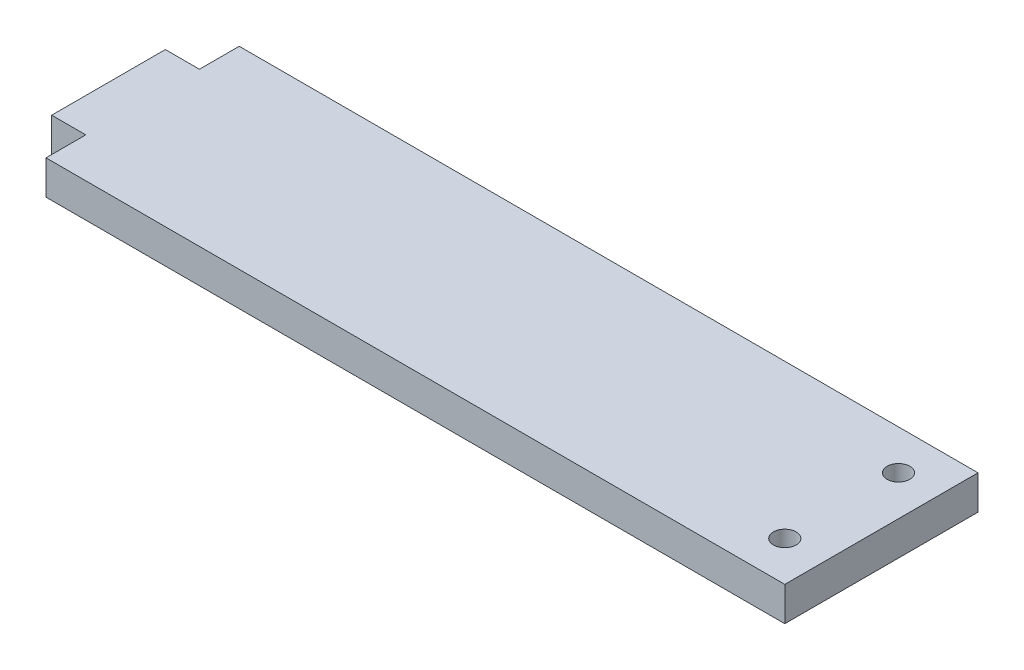
ISO-10303-21;
HEADER;
FILE_DESCRIPTION(('STEP AP214'),'2;1');
FILE_NAME('part.step','',(''),(''),'','','');
FILE_SCHEMA(('AUTOMOTIVE_DESIGN { 1 0 10303 214 1 1 1 1 }'));
ENDSEC;
DATA;
#1=APPLICATION_CONTEXT('core data for automotive mechanical design processes');
#2=APPLICATION_PROTOCOL_DEFINITION('international standard','automotive_design',2000,#1);
#3=PRODUCT_CONTEXT('',#1,'mechanical');
#4=PRODUCT('Part','Part','',(#3));
#5=PRODUCT_RELATED_PRODUCT_CATEGORY('part','',(#4));
#6=PRODUCT_DEFINITION_FORMATION('','',#4);
#7=PRODUCT_DEFINITION_CONTEXT('part definition',#1,'design');
#8=PRODUCT_DEFINITION('design','',#6,#7);
#9=PRODUCT_DEFINITION_SHAPE('','',#8);
#10=(LENGTH_UNIT() NAMED_UNIT(*) SI_UNIT(.MILLI.,.METRE.));
#11=(NAMED_UNIT(*) PLANE_ANGLE_UNIT() SI_UNIT($,.RADIAN.));
#12=(NAMED_UNIT(*) SI_UNIT($,.STERADIAN.) SOLID_ANGLE_UNIT());
#13=UNCERTAINTY_MEASURE_WITH_UNIT(LENGTH_MEASURE(1.E-05),#10,'distance_accuracy_value','');
#14=(GEOMETRIC_REPRESENTATION_CONTEXT(3) GLOBAL_UNCERTAINTY_ASSIGNED_CONTEXT((#13)) GLOBAL_UNIT_ASSIGNED_CONTEXT((#10,
#11,#12)) REPRESENTATION_CONTEXT('',''));
#15=CARTESIAN_POINT('',(0.,0.,0.));
#16=DIRECTION('',(0.,0.,1.));
#17=DIRECTION('',(1.,0.,0.));
#18=AXIS2_PLACEMENT_3D('',#15,#16,#17);
#19=CARTESIAN_POINT('',(-353.88953364633,6.,-10.));
#20=DIRECTION('',(0.,0.,1.));
#21=DIRECTION('',(1.,0.,0.));
#22=AXIS2_PLACEMENT_3D('',#19,#20,#21);
#23=PLANE('',#22);
#24=DIRECTION('',(-1.,0.,0.));
#25=VECTOR('',#24,1.);
#26=CARTESIAN_POINT('',(-353.88953364633,0.,-10.));
#27=LINE('',#26,#25);
#28=CARTESIAN_POINT('',(-347.88953364633,0.,-10.));
#29=VERTEX_POINT('',#28);
#30=CARTESIAN_POINT('',(-353.88953364633,0.,-10.));
#31=VERTEX_POINT('',#30);
#32=EDGE_CURVE('E130',#29,#31,#27,.T.);
#33=ORIENTED_EDGE('',*,*,#32,.T.);
#34=DIRECTION('',(0.,-1.,0.));
#35=VECTOR('',#34,1.);
#36=CARTESIAN_POINT('',(-353.88953364633,6.,-10.));
#37=LINE('',#36,#35);
#38=CARTESIAN_POINT('',(-353.88953364633,6.,-10.));
#39=VERTEX_POINT('',#38);
#40=EDGE_CURVE('E11',#39,#31,#37,.T.);
#41=ORIENTED_EDGE('',*,*,#40,.F.);
#42=DIRECTION('',(-1.,0.,0.));
#43=VECTOR('',#42,1.);
#44=CARTESIAN_POINT('',(-353.88953364633,6.,-10.));
#45=LINE('',#44,#43);
#46=CARTESIAN_POINT('',(-347.88953364633,6.,-10.));
#47=VERTEX_POINT('',#46);
#48=EDGE_CURVE('E145',#47,#39,#45,.T.);
#49=ORIENTED_EDGE('',*,*,#48,.F.);
#50=DIRECTION('',(0.,-1.,0.));
#51=VECTOR('',#50,1.);
#52=CARTESIAN_POINT('',(-347.88953364633,6.,-10.));
#53=LINE('',#52,#51);
#54=EDGE_CURVE('E126',#47,#29,#53,.T.);
#55=ORIENTED_EDGE('',*,*,#54,.T.);
#56=EDGE_LOOP('',(#33,#41,#49,#55));
#57=FACE_BOUND('',#56,.T.);
#58=ADVANCED_FACE('F34',(#57),#23,.F.);
#59=CARTESIAN_POINT('',(-353.88953364633,6.,-10.));
#60=DIRECTION('',(1.,0.,0.));
#61=DIRECTION('',(0.,0.,-1.));
#62=AXIS2_PLACEMENT_3D('',#59,#60,#61);
#63=PLANE('',#62);
#64=DIRECTION('',(0.,0.,1.));
#65=VECTOR('',#64,1.);
#66=CARTESIAN_POINT('',(-353.88953364633,0.,-10.));
#67=LINE('',#66,#65);
#68=CARTESIAN_POINT('',(-353.88953364633,0.,10.));
#69=VERTEX_POINT('',#68);
#70=EDGE_CURVE('E133',#31,#69,#67,.T.);
#71=ORIENTED_EDGE('',*,*,#70,.T.);
#72=DIRECTION('',(0.,-1.,0.));
#73=VECTOR('',#72,1.);
#74=CARTESIAN_POINT('',(-353.88953364633,6.,10.));
#75=LINE('',#74,#73);
#76=CARTESIAN_POINT('',(-353.88953364633,6.,10.));
#77=VERTEX_POINT('',#76);
#78=EDGE_CURVE('E42',#77,#69,#75,.T.);
#79=ORIENTED_EDGE('',*,*,#78,.F.);
#80=DIRECTION('',(0.,0.,1.));
#81=VECTOR('',#80,1.);
#82=CARTESIAN_POINT('',(-353.88953364633,6.,-10.));
#83=LINE('',#82,#81);
#84=EDGE_CURVE('E93',#39,#77,#83,.T.);
#85=ORIENTED_EDGE('',*,*,#84,.F.);
#86=ORIENTED_EDGE('',*,*,#40,.T.);
#87=EDGE_LOOP('',(#71,#79,#85,#86));
#88=FACE_BOUND('',#87,.T.);
#89=ADVANCED_FACE('F229',(#88),#63,.F.);
#90=CARTESIAN_POINT('',(-353.88953364633,6.,10.));
#91=DIRECTION('',(0.,0.,-1.));
#92=DIRECTION('',(-1.,0.,0.));
#93=AXIS2_PLACEMENT_3D('',#90,#91,#92);
#94=PLANE('',#93);
#95=DIRECTION('',(1.,0.,0.));
#96=VECTOR('',#95,1.);
#97=CARTESIAN_POINT('',(-353.88953364633,0.,10.));
#98=LINE('',#97,#96);
#99=CARTESIAN_POINT('',(-347.88953364633,0.,10.));
#100=VERTEX_POINT('',#99);
#101=EDGE_CURVE('E136',#69,#100,#98,.T.);
#102=ORIENTED_EDGE('',*,*,#101,.T.);
#103=DIRECTION('',(0.,-1.,0.));
#104=VECTOR('',#103,1.);
#105=CARTESIAN_POINT('',(-347.88953364633,6.,10.));
#106=LINE('',#105,#104);
#107=CARTESIAN_POINT('',(-347.88953364633,6.,10.));
#108=VERTEX_POINT('',#107);
#109=EDGE_CURVE('E152',#108,#100,#106,.T.);
#110=ORIENTED_EDGE('',*,*,#109,.F.);
#111=DIRECTION('',(1.,0.,0.));
#112=VECTOR('',#111,1.);
#113=CARTESIAN_POINT('',(-353.88953364633,6.,10.));
#114=LINE('',#113,#112);
#115=EDGE_CURVE('E160',#77,#108,#114,.T.);
#116=ORIENTED_EDGE('',*,*,#115,.F.);
#117=ORIENTED_EDGE('',*,*,#78,.T.);
#118=EDGE_LOOP('',(#102,#110,#116,#117));
#119=FACE_BOUND('',#118,.T.);
#120=ADVANCED_FACE('F158',(#119),#94,.F.);
#121=CARTESIAN_POINT('',(-347.88953364633,6.,10.));
#122=DIRECTION('',(1.,0.,0.));
#123=DIRECTION('',(0.,0.,-1.));
#124=AXIS2_PLACEMENT_3D('',#121,#122,#123);
#125=PLANE('',#124);
#126=CARTESIAN_POINT('',(-347.88953364633,3.,13.5));
#127=DIRECTION('',(-1.,0.,0.));
#128=DIRECTION('',(0.,0.,1.));
#129=AXIS2_PLACEMENT_3D('',#126,#127,#128);
#130=CIRCLE('',#129,2.);
#131=CARTESIAN_POINT('',(-347.88953364633,3.,15.5));
#132=VERTEX_POINT('',#131);
#133=EDGE_CURVE('E184',#132,#132,#130,.T.);
#134=ORIENTED_EDGE('',*,*,#133,.F.);
#135=EDGE_LOOP('',(#134));
#136=FACE_BOUND('',#135,.T.);
#137=DIRECTION('',(0.,0.,1.));
#138=VECTOR('',#137,1.);
#139=CARTESIAN_POINT('',(-347.88953364633,0.,10.));
#140=LINE('',#139,#138);
#141=CARTESIAN_POINT('',(-347.88953364633,0.,17.));
#142=VERTEX_POINT('',#141);
#143=EDGE_CURVE('E138',#100,#142,#140,.T.);
#144=ORIENTED_EDGE('',*,*,#143,.T.);
#145=DIRECTION('',(0.,-1.,0.));
#146=VECTOR('',#145,1.);
#147=CARTESIAN_POINT('',(-347.88953364633,6.,17.));
#148=LINE('',#147,#146);
#149=CARTESIAN_POINT('',(-347.88953364633,6.,17.));
#150=VERTEX_POINT('',#149);
#151=EDGE_CURVE('E149',#150,#142,#148,.T.);
#152=ORIENTED_EDGE('',*,*,#151,.F.);
#153=DIRECTION('',(0.,0.,1.));
#154=VECTOR('',#153,1.);
#155=CARTESIAN_POINT('',(-347.88953364633,6.,10.));
#156=LINE('',#155,#154);
#157=EDGE_CURVE('E172',#108,#150,#156,.T.);
#158=ORIENTED_EDGE('',*,*,#157,.F.);
#159=ORIENTED_EDGE('',*,*,#109,.T.);
#160=EDGE_LOOP('',(#144,#152,#158,#159));
#161=FACE_BOUND('',#160,.T.);
#162=ADVANCED_FACE('F168',(#136,#161),#125,.F.);
#163=CARTESIAN_POINT('',(-347.88953364633,6.,17.));
#164=DIRECTION('',(0.,0.,-1.));
#165=DIRECTION('',(-1.,0.,0.));
#166=AXIS2_PLACEMENT_3D('',#163,#164,#165);
#167=PLANE('',#166);
#168=DIRECTION('',(1.,0.,0.));
#169=VECTOR('',#168,1.);
#170=CARTESIAN_POINT('',(-347.88953364633,0.,17.));
#171=LINE('',#170,#169);
#172=CARTESIAN_POINT('',(-217.88953364633,0.,17.));
#173=VERTEX_POINT('',#172);
#174=EDGE_CURVE('E140',#142,#173,#171,.T.);
#175=ORIENTED_EDGE('',*,*,#174,.T.);
#176=DIRECTION('',(0.,-1.,0.));
#177=VECTOR('',#176,1.);
#178=CARTESIAN_POINT('',(-217.88953364633,6.,17.));
#179=LINE('',#178,#177);
#180=CARTESIAN_POINT('',(-217.88953364633,6.,17.));
#181=VERTEX_POINT('',#180);
#182=EDGE_CURVE('E121',#181,#173,#179,.T.);
#183=ORIENTED_EDGE('',*,*,#182,.F.);
#184=DIRECTION('',(1.,0.,0.));
#185=VECTOR('',#184,1.);
#186=CARTESIAN_POINT('',(-347.88953364633,6.,17.));
#187=LINE('',#186,#185);
#188=EDGE_CURVE('E112',#150,#181,#187,.T.);
#189=ORIENTED_EDGE('',*,*,#188,.F.);
#190=ORIENTED_EDGE('',*,*,#151,.T.);
#191=EDGE_LOOP('',(#175,#183,#189,#190));
#192=FACE_BOUND('',#191,.T.);
#193=ADVANCED_FACE('F171',(#192),#167,.F.);
#194=CARTESIAN_POINT('',(-217.88953364633,6.,-17.));
#195=DIRECTION('',(-1.,0.,0.));
#196=DIRECTION('',(0.,0.,1.));
#197=AXIS2_PLACEMENT_3D('',#194,#195,#196);
#198=PLANE('',#197);
#199=DIRECTION('',(0.,0.,-1.));
#200=VECTOR('',#199,1.);
#201=CARTESIAN_POINT('',(-217.88953364633,0.,-17.));
#202=LINE('',#201,#200);
#203=CARTESIAN_POINT('',(-217.88953364633,0.,-17.));
#204=VERTEX_POINT('',#203);
#205=EDGE_CURVE('E120',#173,#204,#202,.T.);
#206=ORIENTED_EDGE('',*,*,#205,.T.);
#207=DIRECTION('',(0.,-1.,0.));
#208=VECTOR('',#207,1.);
#209=CARTESIAN_POINT('',(-217.88953364633,6.,-17.));
#210=LINE('',#209,#208);
#211=CARTESIAN_POINT('',(-217.88953364633,6.,-17.));
#212=VERTEX_POINT('',#211);
#213=EDGE_CURVE('E117',#212,#204,#210,.T.);
#214=ORIENTED_EDGE('',*,*,#213,.F.);
#215=DIRECTION('',(0.,0.,-1.));
#216=VECTOR('',#215,1.);
#217=CARTESIAN_POINT('',(-217.88953364633,6.,-17.));
#218=LINE('',#217,#216);
#219=EDGE_CURVE('E106',#181,#212,#218,.T.);
#220=ORIENTED_EDGE('',*,*,#219,.F.);
#221=ORIENTED_EDGE('',*,*,#182,.T.);
#222=EDGE_LOOP('',(#206,#214,#220,#221));
#223=FACE_BOUND('',#222,.T.);
#224=ADVANCED_FACE('F118',(#223),#198,.F.);
#225=CARTESIAN_POINT('',(-347.88953364633,6.,-17.));
#226=DIRECTION('',(0.,0.,1.));
#227=DIRECTION('',(1.,0.,0.));
#228=AXIS2_PLACEMENT_3D('',#225,#226,#227);
#229=PLANE('',#228);
#230=DIRECTION('',(-1.,0.,0.));
#231=VECTOR('',#230,1.);
#232=CARTESIAN_POINT('',(-347.88953364633,0.,-17.));
#233=LINE('',#232,#231);
#234=CARTESIAN_POINT('',(-347.88953364633,0.,-17.));
#235=VERTEX_POINT('',#234);
#236=EDGE_CURVE('E79',#204,#235,#233,.T.);
#237=ORIENTED_EDGE('',*,*,#236,.T.);
#238=DIRECTION('',(0.,-1.,0.));
#239=VECTOR('',#238,1.);
#240=CARTESIAN_POINT('',(-347.88953364633,6.,-17.));
#241=LINE('',#240,#239);
#242=CARTESIAN_POINT('',(-347.88953364633,6.,-17.));
#243=VERTEX_POINT('',#242);
#244=EDGE_CURVE('E122',#243,#235,#241,.T.);
#245=ORIENTED_EDGE('',*,*,#244,.F.);
#246=DIRECTION('',(-1.,0.,0.));
#247=VECTOR('',#246,1.);
#248=CARTESIAN_POINT('',(-347.88953364633,6.,-17.));
#249=LINE('',#248,#247);
#250=EDGE_CURVE('E110',#212,#243,#249,.T.);
#251=ORIENTED_EDGE('',*,*,#250,.F.);
#252=ORIENTED_EDGE('',*,*,#213,.T.);
#253=EDGE_LOOP('',(#237,#245,#251,#252));
#254=FACE_BOUND('',#253,.T.);
#255=ADVANCED_FACE('F124',(#254),#229,.F.);
#256=CARTESIAN_POINT('',(-347.88953364633,6.,-10.));
#257=DIRECTION('',(1.,0.,0.));
#258=DIRECTION('',(0.,0.,-1.));
#259=AXIS2_PLACEMENT_3D('',#256,#257,#258);
#260=PLANE('',#259);
#261=CARTESIAN_POINT('',(-347.88953364633,3.,-13.5));
#262=DIRECTION('',(-1.,0.,0.));
#263=DIRECTION('',(0.,0.,1.));
#264=AXIS2_PLACEMENT_3D('',#261,#262,#263);
#265=CIRCLE('',#264,2.);
#266=CARTESIAN_POINT('',(-347.88953364633,3.,-11.5));
#267=VERTEX_POINT('',#266);
#268=EDGE_CURVE('E178',#267,#267,#265,.T.);
#269=ORIENTED_EDGE('',*,*,#268,.F.);
#270=EDGE_LOOP('',(#269));
#271=FACE_BOUND('',#270,.T.);
#272=DIRECTION('',(0.,0.,1.));
#273=VECTOR('',#272,1.);
#274=CARTESIAN_POINT('',(-347.88953364633,0.,-10.));
#275=LINE('',#274,#273);
#276=EDGE_CURVE('E85',#235,#29,#275,.T.);
#277=ORIENTED_EDGE('',*,*,#276,.T.);
#278=ORIENTED_EDGE('',*,*,#54,.F.);
#279=DIRECTION('',(0.,0.,1.));
#280=VECTOR('',#279,1.);
#281=CARTESIAN_POINT('',(-347.88953364633,6.,-10.));
#282=LINE('',#281,#280);
#283=EDGE_CURVE('E50',#243,#47,#282,.T.);
#284=ORIENTED_EDGE('',*,*,#283,.F.);
#285=ORIENTED_EDGE('',*,*,#244,.T.);
#286=EDGE_LOOP('',(#277,#278,#284,#285));
#287=FACE_BOUND('',#286,.T.);
#288=ADVANCED_FACE('F213',(#271,#287),#260,.F.);
#289=CARTESIAN_POINT('',(0.,6.,0.));
#290=DIRECTION('',(0.,1.,0.));
#291=DIRECTION('',(0.,0.,1.));
#292=AXIS2_PLACEMENT_3D('',#289,#290,#291);
#293=PLANE('',#292);
#294=CARTESIAN_POINT('',(-224.88953364633,6.,10.0000000000001));
#295=DIRECTION('',(0.,1.,0.));
#296=DIRECTION('',(0.,0.,-1.));
#297=AXIS2_PLACEMENT_3D('',#294,#295,#296);
#298=CIRCLE('',#297,2.);
#299=CARTESIAN_POINT('',(-224.88953364633,6.,8.00000000000006));
#300=VERTEX_POINT('',#299);
#301=EDGE_CURVE('E196',#300,#300,#298,.T.);
#302=ORIENTED_EDGE('',*,*,#301,.F.);
#303=EDGE_LOOP('',(#302));
#304=FACE_BOUND('',#303,.T.);
#305=CARTESIAN_POINT('',(-224.88953364633,6.,-9.99999999999998));
#306=DIRECTION('',(0.,1.,0.));
#307=DIRECTION('',(0.,0.,1.));
#308=AXIS2_PLACEMENT_3D('',#305,#306,#307);
#309=CIRCLE('',#308,2.);
#310=CARTESIAN_POINT('',(-224.88953364633,6.,-7.99999999999998));
#311=VERTEX_POINT('',#310);
#312=EDGE_CURVE('E190',#311,#311,#309,.T.);
#313=ORIENTED_EDGE('',*,*,#312,.F.);
#314=EDGE_LOOP('',(#313));
#315=FACE_BOUND('',#314,.T.);
#316=ORIENTED_EDGE('',*,*,#48,.T.);
#317=ORIENTED_EDGE('',*,*,#84,.T.);
#318=ORIENTED_EDGE('',*,*,#115,.T.);
#319=ORIENTED_EDGE('',*,*,#157,.T.);
#320=ORIENTED_EDGE('',*,*,#188,.T.);
#321=ORIENTED_EDGE('',*,*,#219,.T.);
#322=ORIENTED_EDGE('',*,*,#250,.T.);
#323=ORIENTED_EDGE('',*,*,#283,.T.);
#324=EDGE_LOOP('',(#316,#317,#318,#319,#320,#321,#322,#323));
#325=FACE_BOUND('',#324,.T.);
#326=ADVANCED_FACE('F108',(#304,#315,#325),#293,.T.);
#327=CARTESIAN_POINT('',(0.,0.,0.));
#328=DIRECTION('',(0.,1.,0.));
#329=DIRECTION('',(0.,0.,1.));
#330=AXIS2_PLACEMENT_3D('',#327,#328,#329);
#331=PLANE('',#330);
#332=CARTESIAN_POINT('',(-224.88953364633,0.,10.0000000000001));
#333=DIRECTION('',(0.,1.,0.));
#334=DIRECTION('',(0.,0.,-1.));
#335=AXIS2_PLACEMENT_3D('',#332,#333,#334);
#336=CIRCLE('',#335,2.);
#337=CARTESIAN_POINT('',(-224.88953364633,0.,8.00000000000006));
#338=VERTEX_POINT('',#337);
#339=EDGE_CURVE('E193',#338,#338,#336,.T.);
#340=ORIENTED_EDGE('',*,*,#339,.T.);
#341=EDGE_LOOP('',(#340));
#342=FACE_BOUND('',#341,.T.);
#343=CARTESIAN_POINT('',(-224.88953364633,0.,-9.99999999999998));
#344=DIRECTION('',(0.,1.,0.));
#345=DIRECTION('',(0.,0.,1.));
#346=AXIS2_PLACEMENT_3D('',#343,#344,#345);
#347=CIRCLE('',#346,2.);
#348=CARTESIAN_POINT('',(-224.88953364633,0.,-7.99999999999998));
#349=VERTEX_POINT('',#348);
#350=EDGE_CURVE('E187',#349,#349,#347,.T.);
#351=ORIENTED_EDGE('',*,*,#350,.T.);
#352=EDGE_LOOP('',(#351));
#353=FACE_BOUND('',#352,.T.);
#354=ORIENTED_EDGE('',*,*,#32,.F.);
#355=ORIENTED_EDGE('',*,*,#276,.F.);
#356=ORIENTED_EDGE('',*,*,#236,.F.);
#357=ORIENTED_EDGE('',*,*,#205,.F.);
#358=ORIENTED_EDGE('',*,*,#174,.F.);
#359=ORIENTED_EDGE('',*,*,#143,.F.);
#360=ORIENTED_EDGE('',*,*,#101,.F.);
#361=ORIENTED_EDGE('',*,*,#70,.F.);
#362=EDGE_LOOP('',(#354,#355,#356,#357,#358,#359,#360,#361));
#363=FACE_BOUND('',#362,.T.);
#364=ADVANCED_FACE('F164',(#342,#353,#363),#331,.F.);
#365=CARTESIAN_POINT('',(-337.88953364633,3.,-13.5));
#366=DIRECTION('',(-1.,0.,0.));
#367=DIRECTION('',(0.,0.,1.));
#368=AXIS2_PLACEMENT_3D('',#365,#366,#367);
#369=CYLINDRICAL_SURFACE('',#368,2.);
#370=CARTESIAN_POINT('',(-337.88953364633,3.,-13.5));
#371=DIRECTION('',(-1.,0.,0.));
#372=DIRECTION('',(0.,0.,1.));
#373=AXIS2_PLACEMENT_3D('',#370,#371,#372);
#374=CIRCLE('',#373,2.);
#375=CARTESIAN_POINT('',(-337.88953364633,3.,-11.5));
#376=VERTEX_POINT('',#375);
#377=EDGE_CURVE('E134',#376,#376,#374,.T.);
#378=ORIENTED_EDGE('',*,*,#377,.F.);
#379=EDGE_LOOP('',(#378));
#380=FACE_BOUND('',#379,.T.);
#381=ORIENTED_EDGE('',*,*,#268,.T.);
#382=EDGE_LOOP('',(#381));
#383=FACE_BOUND('',#382,.T.);
#384=ADVANCED_FACE('F297',(#380,#383),#369,.F.);
#385=CARTESIAN_POINT('',(-337.88953364633,3.,-13.5));
#386=DIRECTION('',(-1.,0.,0.));
#387=DIRECTION('',(0.,0.,1.));
#388=AXIS2_PLACEMENT_3D('',#385,#386,#387);
#389=PLANE('',#388);
#390=ORIENTED_EDGE('',*,*,#377,.T.);
#391=EDGE_LOOP('',(#390));
#392=FACE_BOUND('',#391,.T.);
#393=ADVANCED_FACE('F304',(#392),#389,.T.);
#394=CARTESIAN_POINT('',(-337.88953364633,3.,13.5));
#395=DIRECTION('',(-1.,0.,0.));
#396=DIRECTION('',(0.,0.,1.));
#397=AXIS2_PLACEMENT_3D('',#394,#395,#396);
#398=CYLINDRICAL_SURFACE('',#397,2.);
#399=CARTESIAN_POINT('',(-337.88953364633,3.,13.5));
#400=DIRECTION('',(-1.,0.,0.));
#401=DIRECTION('',(0.,0.,1.));
#402=AXIS2_PLACEMENT_3D('',#399,#400,#401);
#403=CIRCLE('',#402,2.);
#404=CARTESIAN_POINT('',(-337.88953364633,3.,15.5));
#405=VERTEX_POINT('',#404);
#406=EDGE_CURVE('E181',#405,#405,#403,.T.);
#407=ORIENTED_EDGE('',*,*,#406,.F.);
#408=EDGE_LOOP('',(#407));
#409=FACE_BOUND('',#408,.T.);
#410=ORIENTED_EDGE('',*,*,#133,.T.);
#411=EDGE_LOOP('',(#410));
#412=FACE_BOUND('',#411,.T.);
#413=ADVANCED_FACE('F224',(#409,#412),#398,.F.);
#414=CARTESIAN_POINT('',(-337.88953364633,3.,13.5));
#415=DIRECTION('',(-1.,0.,0.));
#416=DIRECTION('',(0.,0.,1.));
#417=AXIS2_PLACEMENT_3D('',#414,#415,#416);
#418=PLANE('',#417);
#419=ORIENTED_EDGE('',*,*,#406,.T.);
#420=EDGE_LOOP('',(#419));
#421=FACE_BOUND('',#420,.T.);
#422=ADVANCED_FACE('F218',(#421),#418,.T.);
#423=CARTESIAN_POINT('',(-224.88953364633,0.,-9.99999999999998));
#424=DIRECTION('',(0.,1.,0.));
#425=DIRECTION('',(0.,0.,1.));
#426=AXIS2_PLACEMENT_3D('',#423,#424,#425);
#427=CYLINDRICAL_SURFACE('',#426,2.);
#428=ORIENTED_EDGE('',*,*,#350,.F.);
#429=EDGE_LOOP('',(#428));
#430=FACE_BOUND('',#429,.T.);
#431=ORIENTED_EDGE('',*,*,#312,.T.);
#432=EDGE_LOOP('',(#431));
#433=FACE_BOUND('',#432,.T.);
#434=ADVANCED_FACE('F207',(#430,#433),#427,.F.);
#435=CARTESIAN_POINT('',(-224.88953364633,0.,10.0000000000001));
#436=DIRECTION('',(0.,1.,0.));
#437=DIRECTION('',(0.,0.,1.));
#438=AXIS2_PLACEMENT_3D('',#435,#436,#437);
#439=CYLINDRICAL_SURFACE('',#438,2.);
#440=ORIENTED_EDGE('',*,*,#339,.F.);
#441=EDGE_LOOP('',(#440));
#442=FACE_BOUND('',#441,.T.);
#443=ORIENTED_EDGE('',*,*,#301,.T.);
#444=EDGE_LOOP('',(#443));
#445=FACE_BOUND('',#444,.T.);
#446=ADVANCED_FACE('F204',(#442,#445),#439,.F.);
#447=CLOSED_SHELL('',(#58,#89,#120,#162,#193,#224,#255,#288,#326,#364,#384,#393,#413,#422,#434,#446));
#448=MANIFOLD_SOLID_BREP('B2',#447);
#449=ADVANCED_BREP_SHAPE_REPRESENTATION('',(#18,#448),#14);
#450=SHAPE_DEFINITION_REPRESENTATION(#9,#449);
ENDSEC;
END-ISO-10303-21;
